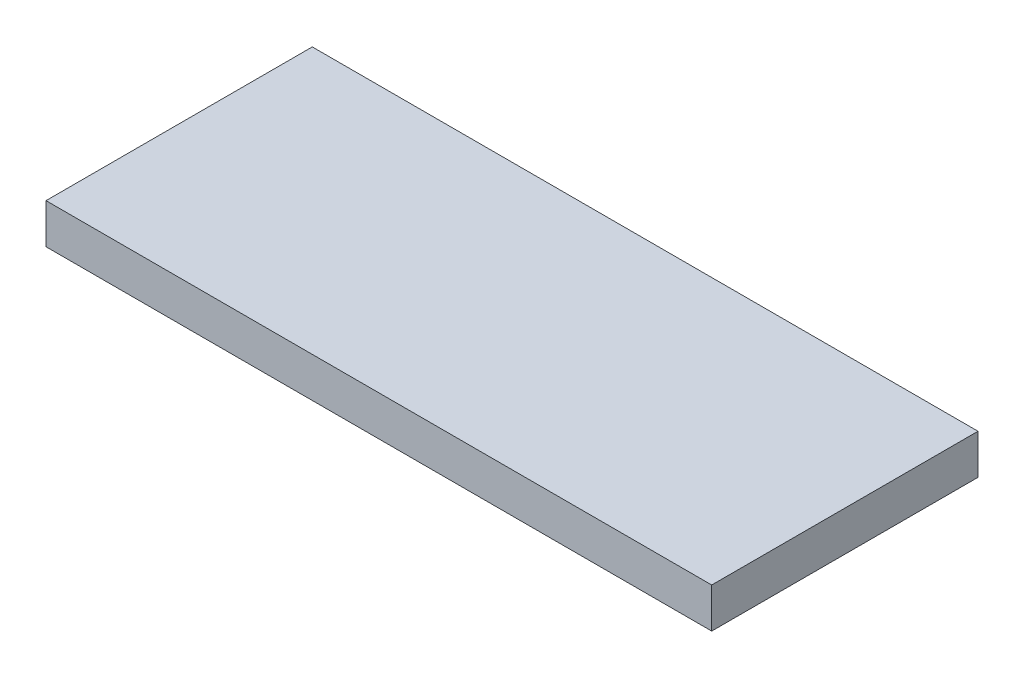
ISO-10303-21;
HEADER;
FILE_DESCRIPTION(('STEP AP214'),'2;1');
FILE_NAME('part.step','',(''),(''),'','','');
FILE_SCHEMA(('AUTOMOTIVE_DESIGN { 1 0 10303 214 1 1 1 1 }'));
ENDSEC;
DATA;
#1=APPLICATION_CONTEXT('core data for automotive mechanical design processes');
#2=APPLICATION_PROTOCOL_DEFINITION('international standard','automotive_design',2000,#1);
#3=PRODUCT_CONTEXT('',#1,'mechanical');
#4=PRODUCT('Part','Part','',(#3));
#5=PRODUCT_RELATED_PRODUCT_CATEGORY('part','',(#4));
#6=PRODUCT_DEFINITION_FORMATION('','',#4);
#7=PRODUCT_DEFINITION_CONTEXT('part definition',#1,'design');
#8=PRODUCT_DEFINITION('design','',#6,#7);
#9=PRODUCT_DEFINITION_SHAPE('','',#8);
#10=(LENGTH_UNIT() NAMED_UNIT(*) SI_UNIT(.MILLI.,.METRE.));
#11=(NAMED_UNIT(*) PLANE_ANGLE_UNIT() SI_UNIT($,.RADIAN.));
#12=(NAMED_UNIT(*) SI_UNIT($,.STERADIAN.) SOLID_ANGLE_UNIT());
#13=UNCERTAINTY_MEASURE_WITH_UNIT(LENGTH_MEASURE(1.E-05),#10,'distance_accuracy_value','');
#14=(GEOMETRIC_REPRESENTATION_CONTEXT(3) GLOBAL_UNCERTAINTY_ASSIGNED_CONTEXT((#13)) GLOBAL_UNIT_ASSIGNED_CONTEXT((#10,
#11,#12)) REPRESENTATION_CONTEXT('',''));
#15=CARTESIAN_POINT('',(0.,0.,0.));
#16=DIRECTION('',(0.,0.,1.));
#17=DIRECTION('',(1.,0.,0.));
#18=AXIS2_PLACEMENT_3D('',#15,#16,#17);
#19=CARTESIAN_POINT('',(25.,3.,10.));
#20=DIRECTION('',(-1.,0.,0.));
#21=DIRECTION('',(0.,0.,1.));
#22=AXIS2_PLACEMENT_3D('',#19,#20,#21);
#23=PLANE('',#22);
#24=DIRECTION('',(0.,0.,-1.));
#25=VECTOR('',#24,1.);
#26=CARTESIAN_POINT('',(25.,0.,10.));
#27=LINE('',#26,#25);
#28=CARTESIAN_POINT('',(25.,0.,10.));
#29=VERTEX_POINT('',#28);
#30=CARTESIAN_POINT('',(25.,0.,-10.));
#31=VERTEX_POINT('',#30);
#32=EDGE_CURVE('E107',#29,#31,#27,.T.);
#33=ORIENTED_EDGE('',*,*,#32,.T.);
#34=DIRECTION('',(0.,-1.,0.));
#35=VECTOR('',#34,1.);
#36=CARTESIAN_POINT('',(25.,3.,-10.));
#37=LINE('',#36,#35);
#38=CARTESIAN_POINT('',(25.,3.,-10.));
#39=VERTEX_POINT('',#38);
#40=EDGE_CURVE('E11',#39,#31,#37,.T.);
#41=ORIENTED_EDGE('',*,*,#40,.F.);
#42=DIRECTION('',(0.,0.,-1.));
#43=VECTOR('',#42,1.);
#44=CARTESIAN_POINT('',(25.,3.,10.));
#45=LINE('',#44,#43);
#46=CARTESIAN_POINT('',(25.,3.,10.));
#47=VERTEX_POINT('',#46);
#48=EDGE_CURVE('E91',#47,#39,#45,.T.);
#49=ORIENTED_EDGE('',*,*,#48,.F.);
#50=DIRECTION('',(0.,-1.,0.));
#51=VECTOR('',#50,1.);
#52=CARTESIAN_POINT('',(25.,3.,10.));
#53=LINE('',#52,#51);
#54=EDGE_CURVE('E103',#47,#29,#53,.T.);
#55=ORIENTED_EDGE('',*,*,#54,.T.);
#56=EDGE_LOOP('',(#33,#41,#49,#55));
#57=FACE_BOUND('',#56,.T.);
#58=ADVANCED_FACE('F39',(#57),#23,.F.);
#59=CARTESIAN_POINT('',(-25.,3.,-10.));
#60=DIRECTION('',(0.,0.,1.));
#61=DIRECTION('',(1.,0.,0.));
#62=AXIS2_PLACEMENT_3D('',#59,#60,#61);
#63=PLANE('',#62);
#64=DIRECTION('',(-1.,0.,0.));
#65=VECTOR('',#64,1.);
#66=CARTESIAN_POINT('',(-25.,0.,-10.));
#67=LINE('',#66,#65);
#68=CARTESIAN_POINT('',(-25.,0.,-10.));
#69=VERTEX_POINT('',#68);
#70=EDGE_CURVE('E96',#31,#69,#67,.T.);
#71=ORIENTED_EDGE('',*,*,#70,.T.);
#72=DIRECTION('',(0.,-1.,0.));
#73=VECTOR('',#72,1.);
#74=CARTESIAN_POINT('',(-25.,3.,-10.));
#75=LINE('',#74,#73);
#76=CARTESIAN_POINT('',(-25.,3.,-10.));
#77=VERTEX_POINT('',#76);
#78=EDGE_CURVE('E48',#77,#69,#75,.T.);
#79=ORIENTED_EDGE('',*,*,#78,.F.);
#80=DIRECTION('',(-1.,0.,0.));
#81=VECTOR('',#80,1.);
#82=CARTESIAN_POINT('',(-25.,3.,-10.));
#83=LINE('',#82,#81);
#84=EDGE_CURVE('E86',#39,#77,#83,.T.);
#85=ORIENTED_EDGE('',*,*,#84,.F.);
#86=ORIENTED_EDGE('',*,*,#40,.T.);
#87=EDGE_LOOP('',(#71,#79,#85,#86));
#88=FACE_BOUND('',#87,.T.);
#89=ADVANCED_FACE('F95',(#88),#63,.F.);
#90=CARTESIAN_POINT('',(-25.,3.,10.));
#91=DIRECTION('',(1.,0.,0.));
#92=DIRECTION('',(0.,0.,-1.));
#93=AXIS2_PLACEMENT_3D('',#90,#91,#92);
#94=PLANE('',#93);
#95=DIRECTION('',(0.,0.,1.));
#96=VECTOR('',#95,1.);
#97=CARTESIAN_POINT('',(-25.,0.,10.));
#98=LINE('',#97,#96);
#99=CARTESIAN_POINT('',(-25.,0.,10.));
#100=VERTEX_POINT('',#99);
#101=EDGE_CURVE('E73',#69,#100,#98,.T.);
#102=ORIENTED_EDGE('',*,*,#101,.T.);
#103=DIRECTION('',(0.,-1.,0.));
#104=VECTOR('',#103,1.);
#105=CARTESIAN_POINT('',(-25.,3.,10.));
#106=LINE('',#105,#104);
#107=CARTESIAN_POINT('',(-25.,3.,10.));
#108=VERTEX_POINT('',#107);
#109=EDGE_CURVE('E98',#108,#100,#106,.T.);
#110=ORIENTED_EDGE('',*,*,#109,.F.);
#111=DIRECTION('',(0.,0.,1.));
#112=VECTOR('',#111,1.);
#113=CARTESIAN_POINT('',(-25.,3.,10.));
#114=LINE('',#113,#112);
#115=EDGE_CURVE('E89',#77,#108,#114,.T.);
#116=ORIENTED_EDGE('',*,*,#115,.F.);
#117=ORIENTED_EDGE('',*,*,#78,.T.);
#118=EDGE_LOOP('',(#102,#110,#116,#117));
#119=FACE_BOUND('',#118,.T.);
#120=ADVANCED_FACE('F99',(#119),#94,.F.);
#121=CARTESIAN_POINT('',(-25.,3.,10.));
#122=DIRECTION('',(0.,0.,-1.));
#123=DIRECTION('',(-1.,0.,0.));
#124=AXIS2_PLACEMENT_3D('',#121,#122,#123);
#125=PLANE('',#124);
#126=DIRECTION('',(1.,0.,0.));
#127=VECTOR('',#126,1.);
#128=CARTESIAN_POINT('',(-25.,0.,10.));
#129=LINE('',#128,#127);
#130=EDGE_CURVE('E79',#100,#29,#129,.T.);
#131=ORIENTED_EDGE('',*,*,#130,.T.);
#132=ORIENTED_EDGE('',*,*,#54,.F.);
#133=DIRECTION('',(1.,0.,0.));
#134=VECTOR('',#133,1.);
#135=CARTESIAN_POINT('',(-25.,3.,10.));
#136=LINE('',#135,#134);
#137=EDGE_CURVE('E56',#108,#47,#136,.T.);
#138=ORIENTED_EDGE('',*,*,#137,.F.);
#139=ORIENTED_EDGE('',*,*,#109,.T.);
#140=EDGE_LOOP('',(#131,#132,#138,#139));
#141=FACE_BOUND('',#140,.T.);
#142=ADVANCED_FACE('F120',(#141),#125,.F.);
#143=CARTESIAN_POINT('',(0.,3.,0.));
#144=DIRECTION('',(0.,-1.,0.));
#145=DIRECTION('',(0.,0.,-1.));
#146=AXIS2_PLACEMENT_3D('',#143,#144,#145);
#147=PLANE('',#146);
#148=ORIENTED_EDGE('',*,*,#48,.T.);
#149=ORIENTED_EDGE('',*,*,#84,.T.);
#150=ORIENTED_EDGE('',*,*,#115,.T.);
#151=ORIENTED_EDGE('',*,*,#137,.T.);
#152=EDGE_LOOP('',(#148,#149,#150,#151));
#153=FACE_BOUND('',#152,.T.);
#154=ADVANCED_FACE('F87',(#153),#147,.F.);
#155=CARTESIAN_POINT('',(0.,0.,0.));
#156=DIRECTION('',(0.,-1.,0.));
#157=DIRECTION('',(0.,0.,-1.));
#158=AXIS2_PLACEMENT_3D('',#155,#156,#157);
#159=PLANE('',#158);
#160=ORIENTED_EDGE('',*,*,#32,.F.);
#161=ORIENTED_EDGE('',*,*,#130,.F.);
#162=ORIENTED_EDGE('',*,*,#101,.F.);
#163=ORIENTED_EDGE('',*,*,#70,.F.);
#164=EDGE_LOOP('',(#160,#161,#162,#163));
#165=FACE_BOUND('',#164,.T.);
#166=ADVANCED_FACE('F123',(#165),#159,.T.);
#167=CLOSED_SHELL('',(#58,#89,#120,#142,#154,#166));
#168=MANIFOLD_SOLID_BREP('B2',#167);
#169=ADVANCED_BREP_SHAPE_REPRESENTATION('',(#18,#168),#14);
#170=SHAPE_DEFINITION_REPRESENTATION(#9,#169);
ENDSEC;
END-ISO-10303-21;
